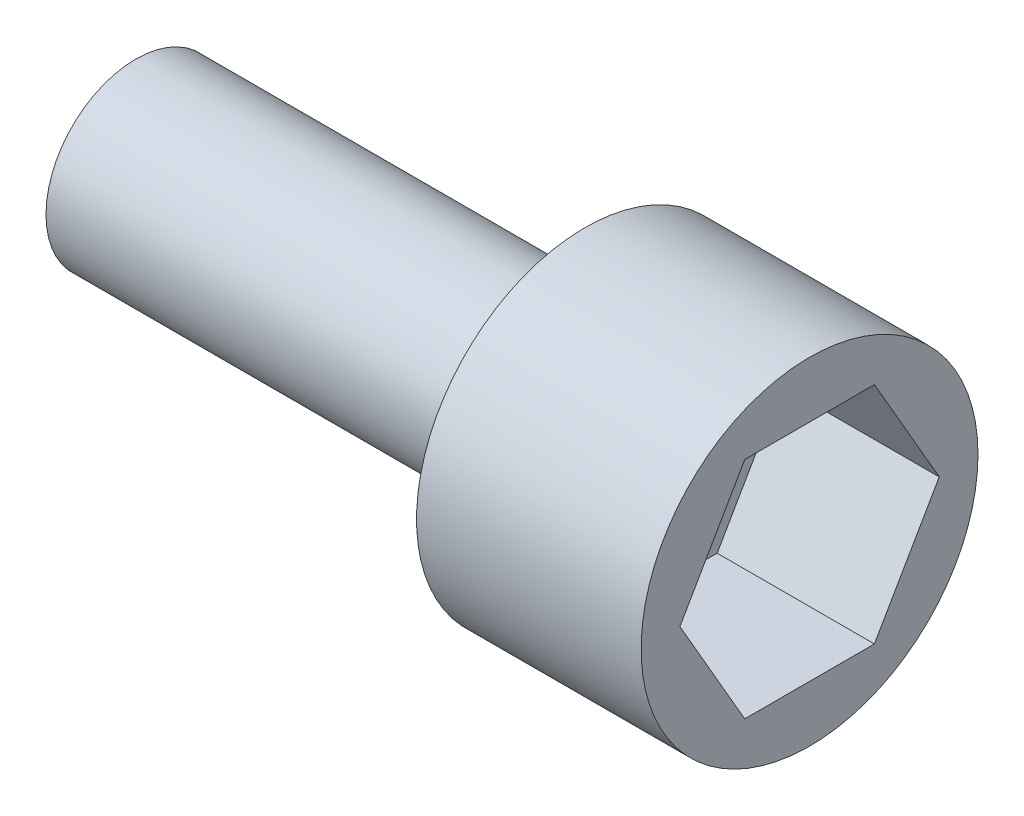
ISO-10303-21;
HEADER;
FILE_DESCRIPTION(('STEP AP214'),'2;1');
FILE_NAME('part.step','',(''),(''),'','','');
FILE_SCHEMA(('AUTOMOTIVE_DESIGN { 1 0 10303 214 1 1 1 1 }'));
ENDSEC;
DATA;
#1=APPLICATION_CONTEXT('core data for automotive mechanical design processes');
#2=APPLICATION_PROTOCOL_DEFINITION('international standard','automotive_design',2000,#1);
#3=PRODUCT_CONTEXT('',#1,'mechanical');
#4=PRODUCT('Part','Part','',(#3));
#5=PRODUCT_RELATED_PRODUCT_CATEGORY('part','',(#4));
#6=PRODUCT_DEFINITION_FORMATION('','',#4);
#7=PRODUCT_DEFINITION_CONTEXT('part definition',#1,'design');
#8=PRODUCT_DEFINITION('design','',#6,#7);
#9=PRODUCT_DEFINITION_SHAPE('','',#8);
#10=(LENGTH_UNIT() NAMED_UNIT(*) SI_UNIT(.MILLI.,.METRE.));
#11=(NAMED_UNIT(*) PLANE_ANGLE_UNIT() SI_UNIT($,.RADIAN.));
#12=(NAMED_UNIT(*) SI_UNIT($,.STERADIAN.) SOLID_ANGLE_UNIT());
#13=UNCERTAINTY_MEASURE_WITH_UNIT(LENGTH_MEASURE(1.E-05),#10,'distance_accuracy_value','');
#14=(GEOMETRIC_REPRESENTATION_CONTEXT(3) GLOBAL_UNCERTAINTY_ASSIGNED_CONTEXT((#13)) GLOBAL_UNIT_ASSIGNED_CONTEXT((#10,
#11,#12)) REPRESENTATION_CONTEXT('',''));
#15=CARTESIAN_POINT('',(0.,0.,0.));
#16=DIRECTION('',(0.,0.,1.));
#17=DIRECTION('',(1.,0.,0.));
#18=AXIS2_PLACEMENT_3D('',#15,#16,#17);
#19=CARTESIAN_POINT('',(0.,0.,0.));
#20=DIRECTION('',(-1.,0.,0.));
#21=DIRECTION('',(0.,0.,1.));
#22=AXIS2_PLACEMENT_3D('',#19,#20,#21);
#23=PLANE('',#22);
#24=CARTESIAN_POINT('',(0.,0.,0.));
#25=DIRECTION('',(1.,0.,0.));
#26=DIRECTION('',(0.,0.,-1.));
#27=AXIS2_PLACEMENT_3D('',#24,#25,#26);
#28=CIRCLE('',#27,4.);
#29=CARTESIAN_POINT('',(0.,0.,-4.));
#30=VERTEX_POINT('',#29);
#31=EDGE_CURVE('E11',#30,#30,#28,.T.);
#32=ORIENTED_EDGE('',*,*,#31,.F.);
#33=EDGE_LOOP('',(#32));
#34=FACE_BOUND('',#33,.T.);
#35=ADVANCED_FACE('F39',(#34),#23,.T.);
#36=CARTESIAN_POINT('',(30.,0.,0.));
#37=DIRECTION('',(1.,0.,0.));
#38=DIRECTION('',(0.,0.,-1.));
#39=AXIS2_PLACEMENT_3D('',#36,#37,#38);
#40=CYLINDRICAL_SURFACE('',#39,4.);
#41=ORIENTED_EDGE('',*,*,#31,.T.);
#42=EDGE_LOOP('',(#41));
#43=FACE_BOUND('',#42,.T.);
#44=CARTESIAN_POINT('',(20.,0.,0.));
#45=DIRECTION('',(1.,0.,0.));
#46=DIRECTION('',(0.,0.,-1.));
#47=AXIS2_PLACEMENT_3D('',#44,#45,#46);
#48=CIRCLE('',#47,4.);
#49=CARTESIAN_POINT('',(20.,0.,-4.));
#50=VERTEX_POINT('',#49);
#51=EDGE_CURVE('E46',#50,#50,#48,.T.);
#52=ORIENTED_EDGE('',*,*,#51,.F.);
#53=EDGE_LOOP('',(#52));
#54=FACE_BOUND('',#53,.T.);
#55=ADVANCED_FACE('F157',(#43,#54),#40,.T.);
#56=CARTESIAN_POINT('',(20.,4.,0.));
#57=DIRECTION('',(-1.,0.,0.));
#58=DIRECTION('',(0.,0.,1.));
#59=AXIS2_PLACEMENT_3D('',#56,#57,#58);
#60=PLANE('',#59);
#61=ORIENTED_EDGE('',*,*,#51,.T.);
#62=EDGE_LOOP('',(#61));
#63=FACE_BOUND('',#62,.T.);
#64=CARTESIAN_POINT('',(20.,0.,0.));
#65=DIRECTION('',(1.,0.,0.));
#66=DIRECTION('',(0.,0.,-1.));
#67=AXIS2_PLACEMENT_3D('',#64,#65,#66);
#68=CIRCLE('',#67,7.5);
#69=CARTESIAN_POINT('',(20.,0.,-7.5));
#70=VERTEX_POINT('',#69);
#71=EDGE_CURVE('E149',#70,#70,#68,.T.);
#72=ORIENTED_EDGE('',*,*,#71,.F.);
#73=EDGE_LOOP('',(#72));
#74=FACE_BOUND('',#73,.T.);
#75=ADVANCED_FACE('F151',(#63,#74),#60,.T.);
#76=CARTESIAN_POINT('',(30.,0.,0.));
#77=DIRECTION('',(1.,0.,0.));
#78=DIRECTION('',(0.,0.,-1.));
#79=AXIS2_PLACEMENT_3D('',#76,#77,#78);
#80=CYLINDRICAL_SURFACE('',#79,7.5);
#81=ORIENTED_EDGE('',*,*,#71,.T.);
#82=EDGE_LOOP('',(#81));
#83=FACE_BOUND('',#82,.T.);
#84=CARTESIAN_POINT('',(30.,0.,0.));
#85=DIRECTION('',(1.,0.,0.));
#86=DIRECTION('',(0.,0.,-1.));
#87=AXIS2_PLACEMENT_3D('',#84,#85,#86);
#88=CIRCLE('',#87,7.5);
#89=CARTESIAN_POINT('',(30.,0.,-7.5));
#90=VERTEX_POINT('',#89);
#91=EDGE_CURVE('E139',#90,#90,#88,.T.);
#92=ORIENTED_EDGE('',*,*,#91,.F.);
#93=EDGE_LOOP('',(#92));
#94=FACE_BOUND('',#93,.T.);
#95=ADVANCED_FACE('F161',(#83,#94),#80,.T.);
#96=CARTESIAN_POINT('',(30.,7.5,0.));
#97=DIRECTION('',(1.,0.,0.));
#98=DIRECTION('',(0.,0.,-1.));
#99=AXIS2_PLACEMENT_3D('',#96,#97,#98);
#100=PLANE('',#99);
#101=DIRECTION('',(0.,0.866025403784439,-0.5));
#102=VECTOR('',#101,1.);
#103=CARTESIAN_POINT('',(30.,-5.,-2.88675134594813));
#104=LINE('',#103,#102);
#105=CARTESIAN_POINT('',(30.,-5.,-2.88675134594813));
#106=VERTEX_POINT('',#105);
#107=CARTESIAN_POINT('',(30.,0.,-5.77350269189626));
#108=VERTEX_POINT('',#107);
#109=EDGE_CURVE('E52',#106,#108,#104,.T.);
#110=ORIENTED_EDGE('',*,*,#109,.F.);
#111=DIRECTION('',(0.,0.,-1.));
#112=VECTOR('',#111,1.);
#113=CARTESIAN_POINT('',(30.,-5.,2.88675134594813));
#114=LINE('',#113,#112);
#115=CARTESIAN_POINT('',(30.,-5.,2.88675134594813));
#116=VERTEX_POINT('',#115);
#117=EDGE_CURVE('E136',#116,#106,#114,.T.);
#118=ORIENTED_EDGE('',*,*,#117,.F.);
#119=DIRECTION('',(0.,-0.866025403784439,-0.5));
#120=VECTOR('',#119,1.);
#121=CARTESIAN_POINT('',(30.,0.,5.77350269189626));
#122=LINE('',#121,#120);
#123=CARTESIAN_POINT('',(30.,0.,5.77350269189626));
#124=VERTEX_POINT('',#123);
#125=EDGE_CURVE('E132',#124,#116,#122,.T.);
#126=ORIENTED_EDGE('',*,*,#125,.F.);
#127=DIRECTION('',(0.,-0.866025403784439,0.5));
#128=VECTOR('',#127,1.);
#129=CARTESIAN_POINT('',(30.,5.,2.88675134594813));
#130=LINE('',#129,#128);
#131=CARTESIAN_POINT('',(30.,5.,2.88675134594813));
#132=VERTEX_POINT('',#131);
#133=EDGE_CURVE('E102',#132,#124,#130,.T.);
#134=ORIENTED_EDGE('',*,*,#133,.F.);
#135=DIRECTION('',(0.,0.,1.));
#136=VECTOR('',#135,1.);
#137=CARTESIAN_POINT('',(30.,5.,-2.88675134594813));
#138=LINE('',#137,#136);
#139=CARTESIAN_POINT('',(30.,5.,-2.88675134594813));
#140=VERTEX_POINT('',#139);
#141=EDGE_CURVE('E127',#140,#132,#138,.T.);
#142=ORIENTED_EDGE('',*,*,#141,.F.);
#143=DIRECTION('',(0.,0.866025403784438,0.5));
#144=VECTOR('',#143,1.);
#145=CARTESIAN_POINT('',(30.,0.,-5.77350269189626));
#146=LINE('',#145,#144);
#147=EDGE_CURVE('E130',#108,#140,#146,.T.);
#148=ORIENTED_EDGE('',*,*,#147,.F.);
#149=EDGE_LOOP('',(#110,#118,#126,#134,#142,#148));
#150=FACE_BOUND('',#149,.T.);
#151=ORIENTED_EDGE('',*,*,#91,.T.);
#152=EDGE_LOOP('',(#151));
#153=FACE_BOUND('',#152,.T.);
#154=ADVANCED_FACE('F170',(#150,#153),#100,.T.);
#155=CARTESIAN_POINT('',(23.,-5.,-2.88675134594813));
#156=DIRECTION('',(0.,-0.5,-0.866025403784439));
#157=DIRECTION('',(0.,0.866025403784439,-0.5));
#158=AXIS2_PLACEMENT_3D('',#155,#156,#157);
#159=PLANE('',#158);
#160=ORIENTED_EDGE('',*,*,#109,.T.);
#161=DIRECTION('',(1.,0.,0.));
#162=VECTOR('',#161,1.);
#163=CARTESIAN_POINT('',(23.,0.,-5.77350269189626));
#164=LINE('',#163,#162);
#165=CARTESIAN_POINT('',(23.,0.,-5.77350269189626));
#166=VERTEX_POINT('',#165);
#167=EDGE_CURVE('E81',#166,#108,#164,.T.);
#168=ORIENTED_EDGE('',*,*,#167,.F.);
#169=DIRECTION('',(0.,0.866025403784439,-0.5));
#170=VECTOR('',#169,1.);
#171=CARTESIAN_POINT('',(23.,-5.,-2.88675134594813));
#172=LINE('',#171,#170);
#173=CARTESIAN_POINT('',(23.,-5.,-2.88675134594813));
#174=VERTEX_POINT('',#173);
#175=EDGE_CURVE('E138',#174,#166,#172,.T.);
#176=ORIENTED_EDGE('',*,*,#175,.F.);
#177=DIRECTION('',(1.,0.,0.));
#178=VECTOR('',#177,1.);
#179=CARTESIAN_POINT('',(23.,-5.,-2.88675134594813));
#180=LINE('',#179,#178);
#181=EDGE_CURVE('E63',#174,#106,#180,.T.);
#182=ORIENTED_EDGE('',*,*,#181,.T.);
#183=EDGE_LOOP('',(#160,#168,#176,#182));
#184=FACE_BOUND('',#183,.T.);
#185=ADVANCED_FACE('F171',(#184),#159,.F.);
#186=CARTESIAN_POINT('',(23.,-5.,2.88675134594813));
#187=DIRECTION('',(0.,-1.,0.));
#188=DIRECTION('',(0.,0.,-1.));
#189=AXIS2_PLACEMENT_3D('',#186,#187,#188);
#190=PLANE('',#189);
#191=ORIENTED_EDGE('',*,*,#117,.T.);
#192=ORIENTED_EDGE('',*,*,#181,.F.);
#193=DIRECTION('',(0.,0.,-1.));
#194=VECTOR('',#193,1.);
#195=CARTESIAN_POINT('',(23.,-5.,2.88675134594813));
#196=LINE('',#195,#194);
#197=CARTESIAN_POINT('',(23.,-5.,2.88675134594813));
#198=VERTEX_POINT('',#197);
#199=EDGE_CURVE('E111',#198,#174,#196,.T.);
#200=ORIENTED_EDGE('',*,*,#199,.F.);
#201=DIRECTION('',(1.,0.,0.));
#202=VECTOR('',#201,1.);
#203=CARTESIAN_POINT('',(23.,-5.,2.88675134594813));
#204=LINE('',#203,#202);
#205=EDGE_CURVE('E103',#198,#116,#204,.T.);
#206=ORIENTED_EDGE('',*,*,#205,.T.);
#207=EDGE_LOOP('',(#191,#192,#200,#206));
#208=FACE_BOUND('',#207,.T.);
#209=ADVANCED_FACE('F180',(#208),#190,.F.);
#210=CARTESIAN_POINT('',(23.,0.,5.77350269189626));
#211=DIRECTION('',(0.,-0.5,0.866025403784439));
#212=DIRECTION('',(0.,-0.866025403784439,-0.5));
#213=AXIS2_PLACEMENT_3D('',#210,#211,#212);
#214=PLANE('',#213);
#215=ORIENTED_EDGE('',*,*,#125,.T.);
#216=ORIENTED_EDGE('',*,*,#205,.F.);
#217=DIRECTION('',(0.,-0.866025403784439,-0.5));
#218=VECTOR('',#217,1.);
#219=CARTESIAN_POINT('',(23.,0.,5.77350269189626));
#220=LINE('',#219,#218);
#221=CARTESIAN_POINT('',(23.,0.,5.77350269189626));
#222=VERTEX_POINT('',#221);
#223=EDGE_CURVE('E107',#222,#198,#220,.T.);
#224=ORIENTED_EDGE('',*,*,#223,.F.);
#225=DIRECTION('',(1.,0.,0.));
#226=VECTOR('',#225,1.);
#227=CARTESIAN_POINT('',(23.,0.,5.77350269189626));
#228=LINE('',#227,#226);
#229=EDGE_CURVE('E92',#222,#124,#228,.T.);
#230=ORIENTED_EDGE('',*,*,#229,.T.);
#231=EDGE_LOOP('',(#215,#216,#224,#230));
#232=FACE_BOUND('',#231,.T.);
#233=ADVANCED_FACE('F109',(#232),#214,.F.);
#234=CARTESIAN_POINT('',(23.,5.,2.88675134594813));
#235=DIRECTION('',(0.,0.5,0.866025403784439));
#236=DIRECTION('',(0.,-0.866025403784439,0.5));
#237=AXIS2_PLACEMENT_3D('',#234,#235,#236);
#238=PLANE('',#237);
#239=ORIENTED_EDGE('',*,*,#133,.T.);
#240=ORIENTED_EDGE('',*,*,#229,.F.);
#241=DIRECTION('',(0.,-0.866025403784439,0.5));
#242=VECTOR('',#241,1.);
#243=CARTESIAN_POINT('',(23.,5.,2.88675134594813));
#244=LINE('',#243,#242);
#245=CARTESIAN_POINT('',(23.,5.,2.88675134594813));
#246=VERTEX_POINT('',#245);
#247=EDGE_CURVE('E97',#246,#222,#244,.T.);
#248=ORIENTED_EDGE('',*,*,#247,.F.);
#249=DIRECTION('',(1.,0.,0.));
#250=VECTOR('',#249,1.);
#251=CARTESIAN_POINT('',(23.,5.,2.88675134594813));
#252=LINE('',#251,#250);
#253=EDGE_CURVE('E108',#246,#132,#252,.T.);
#254=ORIENTED_EDGE('',*,*,#253,.T.);
#255=EDGE_LOOP('',(#239,#240,#248,#254));
#256=FACE_BOUND('',#255,.T.);
#257=ADVANCED_FACE('F96',(#256),#238,.F.);
#258=CARTESIAN_POINT('',(23.,5.,-2.88675134594813));
#259=DIRECTION('',(0.,1.,0.));
#260=DIRECTION('',(0.,0.,1.));
#261=AXIS2_PLACEMENT_3D('',#258,#259,#260);
#262=PLANE('',#261);
#263=ORIENTED_EDGE('',*,*,#141,.T.);
#264=ORIENTED_EDGE('',*,*,#253,.F.);
#265=DIRECTION('',(0.,0.,1.));
#266=VECTOR('',#265,1.);
#267=CARTESIAN_POINT('',(23.,5.,-2.88675134594813));
#268=LINE('',#267,#266);
#269=CARTESIAN_POINT('',(23.,5.,-2.88675134594813));
#270=VERTEX_POINT('',#269);
#271=EDGE_CURVE('E117',#270,#246,#268,.T.);
#272=ORIENTED_EDGE('',*,*,#271,.F.);
#273=DIRECTION('',(1.,0.,0.));
#274=VECTOR('',#273,1.);
#275=CARTESIAN_POINT('',(23.,5.,-2.88675134594813));
#276=LINE('',#275,#274);
#277=EDGE_CURVE('E142',#270,#140,#276,.T.);
#278=ORIENTED_EDGE('',*,*,#277,.T.);
#279=EDGE_LOOP('',(#263,#264,#272,#278));
#280=FACE_BOUND('',#279,.T.);
#281=ADVANCED_FACE('F181',(#280),#262,.F.);
#282=CARTESIAN_POINT('',(23.,0.,-5.77350269189626));
#283=DIRECTION('',(0.,0.5,-0.866025403784438));
#284=DIRECTION('',(0.,0.866025403784439,0.5));
#285=AXIS2_PLACEMENT_3D('',#282,#283,#284);
#286=PLANE('',#285);
#287=ORIENTED_EDGE('',*,*,#147,.T.);
#288=ORIENTED_EDGE('',*,*,#277,.F.);
#289=DIRECTION('',(0.,0.866025403784438,0.5));
#290=VECTOR('',#289,1.);
#291=CARTESIAN_POINT('',(23.,0.,-5.77350269189626));
#292=LINE('',#291,#290);
#293=EDGE_CURVE('E123',#166,#270,#292,.T.);
#294=ORIENTED_EDGE('',*,*,#293,.F.);
#295=ORIENTED_EDGE('',*,*,#167,.T.);
#296=EDGE_LOOP('',(#287,#288,#294,#295));
#297=FACE_BOUND('',#296,.T.);
#298=ADVANCED_FACE('F178',(#297),#286,.F.);
#299=CARTESIAN_POINT('',(23.,0.,0.));
#300=DIRECTION('',(1.,0.,0.));
#301=DIRECTION('',(0.,0.,-1.));
#302=AXIS2_PLACEMENT_3D('',#299,#300,#301);
#303=PLANE('',#302);
#304=ORIENTED_EDGE('',*,*,#175,.T.);
#305=ORIENTED_EDGE('',*,*,#293,.T.);
#306=ORIENTED_EDGE('',*,*,#271,.T.);
#307=ORIENTED_EDGE('',*,*,#247,.T.);
#308=ORIENTED_EDGE('',*,*,#223,.T.);
#309=ORIENTED_EDGE('',*,*,#199,.T.);
#310=EDGE_LOOP('',(#304,#305,#306,#307,#308,#309));
#311=FACE_BOUND('',#310,.T.);
#312=ADVANCED_FACE('F118',(#311),#303,.T.);
#313=CLOSED_SHELL('',(#35,#55,#75,#95,#154,#185,#209,#233,#257,#281,#298,#312));
#314=MANIFOLD_SOLID_BREP('B2',#313);
#315=ADVANCED_BREP_SHAPE_REPRESENTATION('',(#18,#314),#14);
#316=SHAPE_DEFINITION_REPRESENTATION(#9,#315);
ENDSEC;
END-ISO-10303-21;
